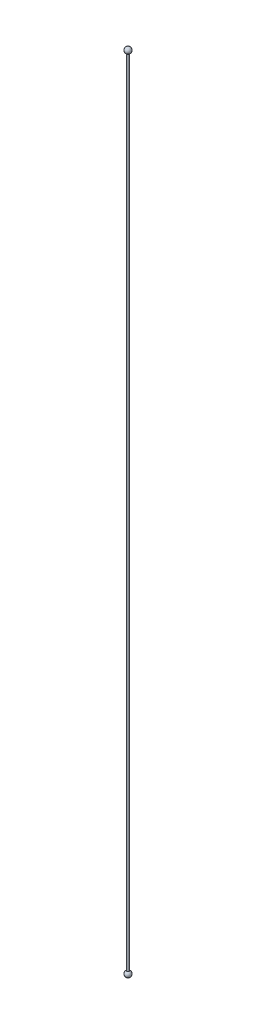
ISO-10303-21;
HEADER;
FILE_DESCRIPTION(('STEP AP214'),'2;1');
FILE_NAME('part.step','',(''),(''),'','','');
FILE_SCHEMA(('AUTOMOTIVE_DESIGN { 1 0 10303 214 1 1 1 1 }'));
ENDSEC;
DATA;
#1=APPLICATION_CONTEXT('core data for automotive mechanical design processes');
#2=APPLICATION_PROTOCOL_DEFINITION('international standard','automotive_design',2000,#1);
#3=PRODUCT_CONTEXT('',#1,'mechanical');
#4=PRODUCT('Part','Part','',(#3));
#5=PRODUCT_RELATED_PRODUCT_CATEGORY('part','',(#4));
#6=PRODUCT_DEFINITION_FORMATION('','',#4);
#7=PRODUCT_DEFINITION_CONTEXT('part definition',#1,'design');
#8=PRODUCT_DEFINITION('design','',#6,#7);
#9=PRODUCT_DEFINITION_SHAPE('','',#8);
#10=(LENGTH_UNIT() NAMED_UNIT(*) SI_UNIT(.MILLI.,.METRE.));
#11=(NAMED_UNIT(*) PLANE_ANGLE_UNIT() SI_UNIT($,.RADIAN.));
#12=(NAMED_UNIT(*) SI_UNIT($,.STERADIAN.) SOLID_ANGLE_UNIT());
#13=UNCERTAINTY_MEASURE_WITH_UNIT(LENGTH_MEASURE(1.E-05),#10,'distance_accuracy_value','');
#14=(GEOMETRIC_REPRESENTATION_CONTEXT(3) GLOBAL_UNCERTAINTY_ASSIGNED_CONTEXT((#13)) GLOBAL_UNIT_ASSIGNED_CONTEXT((#10,
#11,#12)) REPRESENTATION_CONTEXT('',''));
#15=CARTESIAN_POINT('',(0.,0.,0.));
#16=DIRECTION('',(0.,0.,1.));
#17=DIRECTION('',(1.,0.,0.));
#18=AXIS2_PLACEMENT_3D('',#15,#16,#17);
#19=CARTESIAN_POINT('',(0.,135.4,0.));
#20=DIRECTION('',(0.,1.,0.));
#21=DIRECTION('',(1.,0.,0.));
#22=AXIS2_PLACEMENT_3D('',#19,#20,#21);
#23=SPHERICAL_SURFACE('',#22,1.);
#24=CARTESIAN_POINT('',(0.,134.483484861009,0.));
#25=DIRECTION('',(0.,1.,0.));
#26=DIRECTION('',(0.,0.,1.));
#27=AXIS2_PLACEMENT_3D('',#24,#25,#26);
#28=CIRCLE('',#27,0.400000000000002);
#29=CARTESIAN_POINT('',(0.,134.483484861009,0.400000000000002));
#30=VERTEX_POINT('',#29);
#31=EDGE_CURVE('E43',#30,#30,#28,.T.);
#32=ORIENTED_EDGE('',*,*,#31,.T.);
#33=EDGE_LOOP('',(#32));
#34=FACE_BOUND('',#33,.T.);
#35=ADVANCED_FACE('F37',(#34),#23,.T.);
#36=CARTESIAN_POINT('',(0.,-135.4,0.));
#37=DIRECTION('',(0.,1.,0.));
#38=DIRECTION('',(1.,0.,0.));
#39=AXIS2_PLACEMENT_3D('',#36,#37,#38);
#40=SPHERICAL_SURFACE('',#39,1.);
#41=CARTESIAN_POINT('',(0.,-134.483484861009,0.));
#42=DIRECTION('',(0.,1.,0.));
#43=DIRECTION('',(0.,0.,1.));
#44=AXIS2_PLACEMENT_3D('',#41,#42,#43);
#45=CIRCLE('',#44,0.4);
#46=CARTESIAN_POINT('',(0.,-134.483484861009,0.4));
#47=VERTEX_POINT('',#46);
#48=EDGE_CURVE('E10',#47,#47,#45,.T.);
#49=ORIENTED_EDGE('',*,*,#48,.F.);
#50=EDGE_LOOP('',(#49));
#51=FACE_BOUND('',#50,.T.);
#52=ADVANCED_FACE('F52',(#51),#40,.T.);
#53=CARTESIAN_POINT('',(0.,136.4,0.));
#54=DIRECTION('',(0.,1.,0.));
#55=DIRECTION('',(0.,0.,1.));
#56=AXIS2_PLACEMENT_3D('',#53,#54,#55);
#57=CYLINDRICAL_SURFACE('',#56,0.400000000000001);
#58=ORIENTED_EDGE('',*,*,#31,.F.);
#59=EDGE_LOOP('',(#58));
#60=FACE_BOUND('',#59,.T.);
#61=ORIENTED_EDGE('',*,*,#48,.T.);
#62=EDGE_LOOP('',(#61));
#63=FACE_BOUND('',#62,.T.);
#64=ADVANCED_FACE('F50',(#60,#63),#57,.T.);
#65=CLOSED_SHELL('',(#35,#52,#64));
#66=MANIFOLD_SOLID_BREP('B2',#65);
#67=ADVANCED_BREP_SHAPE_REPRESENTATION('',(#18,#66),#14);
#68=SHAPE_DEFINITION_REPRESENTATION(#9,#67);
ENDSEC;
END-ISO-10303-21;
